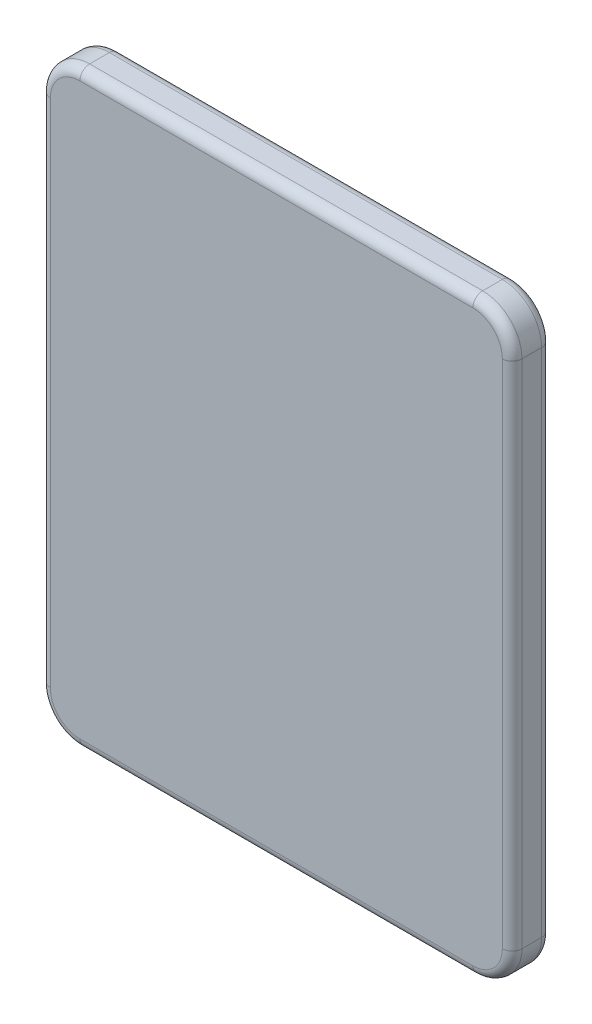
ISO-10303-21;
HEADER;
FILE_DESCRIPTION(('STEP AP214'),'2;1');
FILE_NAME('part.step','',(''),(''),'','','');
FILE_SCHEMA(('AUTOMOTIVE_DESIGN { 1 0 10303 214 1 1 1 1 }'));
ENDSEC;
DATA;
#1=APPLICATION_CONTEXT('core data for automotive mechanical design processes');
#2=APPLICATION_PROTOCOL_DEFINITION('international standard','automotive_design',2000,#1);
#3=PRODUCT_CONTEXT('',#1,'mechanical');
#4=PRODUCT('Part','Part','',(#3));
#5=PRODUCT_RELATED_PRODUCT_CATEGORY('part','',(#4));
#6=PRODUCT_DEFINITION_FORMATION('','',#4);
#7=PRODUCT_DEFINITION_CONTEXT('part definition',#1,'design');
#8=PRODUCT_DEFINITION('design','',#6,#7);
#9=PRODUCT_DEFINITION_SHAPE('','',#8);
#10=(LENGTH_UNIT() NAMED_UNIT(*) SI_UNIT(.MILLI.,.METRE.));
#11=(NAMED_UNIT(*) PLANE_ANGLE_UNIT() SI_UNIT($,.RADIAN.));
#12=(NAMED_UNIT(*) SI_UNIT($,.STERADIAN.) SOLID_ANGLE_UNIT());
#13=UNCERTAINTY_MEASURE_WITH_UNIT(LENGTH_MEASURE(1.E-05),#10,'distance_accuracy_value','');
#14=(GEOMETRIC_REPRESENTATION_CONTEXT(3) GLOBAL_UNCERTAINTY_ASSIGNED_CONTEXT((#13)) GLOBAL_UNIT_ASSIGNED_CONTEXT((#10,
#11,#12)) REPRESENTATION_CONTEXT('',''));
#15=CARTESIAN_POINT('',(0.,0.,0.));
#16=DIRECTION('',(0.,0.,1.));
#17=DIRECTION('',(1.,0.,0.));
#18=AXIS2_PLACEMENT_3D('',#15,#16,#17);
#19=CARTESIAN_POINT('',(-600.,-750.,100.));
#20=DIRECTION('',(1.,0.,0.));
#21=DIRECTION('',(0.,0.,-1.));
#22=AXIS2_PLACEMENT_3D('',#19,#20,#21);
#23=PLANE('',#22);
#24=DIRECTION('',(0.,0.,-1.));
#25=VECTOR('',#24,1.);
#26=CARTESIAN_POINT('',(-600.,650.,100.));
#27=LINE('',#26,#25);
#28=CARTESIAN_POINT('',(-600.,650.,75.));
#29=VERTEX_POINT('',#28);
#30=CARTESIAN_POINT('',(-600.,650.,25.));
#31=VERTEX_POINT('',#30);
#32=EDGE_CURVE('E334',#29,#31,#27,.T.);
#33=ORIENTED_EDGE('',*,*,#32,.T.);
#34=DIRECTION('',(0.,-1.,0.));
#35=VECTOR('',#34,1.);
#36=CARTESIAN_POINT('',(-600.,-750.,25.));
#37=LINE('',#36,#35);
#38=CARTESIAN_POINT('',(-600.,-650.,25.));
#39=VERTEX_POINT('',#38);
#40=EDGE_CURVE('E221',#31,#39,#37,.T.);
#41=ORIENTED_EDGE('',*,*,#40,.T.);
#42=DIRECTION('',(0.,0.,-1.));
#43=VECTOR('',#42,1.);
#44=CARTESIAN_POINT('',(-600.,-650.,100.));
#45=LINE('',#44,#43);
#46=CARTESIAN_POINT('',(-600.,-650.,75.));
#47=VERTEX_POINT('',#46);
#48=EDGE_CURVE('E340',#39,#47,#45,.F.);
#49=ORIENTED_EDGE('',*,*,#48,.T.);
#50=DIRECTION('',(0.,-1.,0.));
#51=VECTOR('',#50,1.);
#52=CARTESIAN_POINT('',(-600.,650.,75.));
#53=LINE('',#52,#51);
#54=EDGE_CURVE('E218',#47,#29,#53,.F.);
#55=ORIENTED_EDGE('',*,*,#54,.T.);
#56=EDGE_LOOP('',(#33,#41,#49,#55));
#57=FACE_BOUND('',#56,.T.);
#58=ADVANCED_FACE('F39',(#57),#23,.F.);
#59=CARTESIAN_POINT('',(600.,-750.,100.));
#60=DIRECTION('',(0.,1.,0.));
#61=DIRECTION('',(-1.,0.,0.));
#62=AXIS2_PLACEMENT_3D('',#59,#60,#61);
#63=PLANE('',#62);
#64=DIRECTION('',(0.,0.,-1.));
#65=VECTOR('',#64,1.);
#66=CARTESIAN_POINT('',(-500.,-750.,100.));
#67=LINE('',#66,#65);
#68=CARTESIAN_POINT('',(-500.,-750.,75.));
#69=VERTEX_POINT('',#68);
#70=CARTESIAN_POINT('',(-500.,-750.,25.));
#71=VERTEX_POINT('',#70);
#72=EDGE_CURVE('E331',#69,#71,#67,.T.);
#73=ORIENTED_EDGE('',*,*,#72,.T.);
#74=DIRECTION('',(1.,0.,0.));
#75=VECTOR('',#74,1.);
#76=CARTESIAN_POINT('',(600.,-750.,25.));
#77=LINE('',#76,#75);
#78=CARTESIAN_POINT('',(500.,-750.,25.));
#79=VERTEX_POINT('',#78);
#80=EDGE_CURVE('E233',#71,#79,#77,.T.);
#81=ORIENTED_EDGE('',*,*,#80,.T.);
#82=DIRECTION('',(0.,0.,-1.));
#83=VECTOR('',#82,1.);
#84=CARTESIAN_POINT('',(500.,-750.,100.));
#85=LINE('',#84,#83);
#86=CARTESIAN_POINT('',(500.,-750.,75.));
#87=VERTEX_POINT('',#86);
#88=EDGE_CURVE('E279',#79,#87,#85,.F.);
#89=ORIENTED_EDGE('',*,*,#88,.T.);
#90=DIRECTION('',(1.,0.,0.));
#91=VECTOR('',#90,1.);
#92=CARTESIAN_POINT('',(-500.,-750.,75.));
#93=LINE('',#92,#91);
#94=EDGE_CURVE('E230',#87,#69,#93,.F.);
#95=ORIENTED_EDGE('',*,*,#94,.T.);
#96=EDGE_LOOP('',(#73,#81,#89,#95));
#97=FACE_BOUND('',#96,.T.);
#98=ADVANCED_FACE('F328',(#97),#63,.F.);
#99=CARTESIAN_POINT('',(600.,-750.,100.));
#100=DIRECTION('',(-1.,0.,0.));
#101=DIRECTION('',(0.,0.,1.));
#102=AXIS2_PLACEMENT_3D('',#99,#100,#101);
#103=PLANE('',#102);
#104=DIRECTION('',(0.,0.,-1.));
#105=VECTOR('',#104,1.);
#106=CARTESIAN_POINT('',(600.,-650.,100.));
#107=LINE('',#106,#105);
#108=CARTESIAN_POINT('',(600.,-650.,75.));
#109=VERTEX_POINT('',#108);
#110=CARTESIAN_POINT('',(600.,-650.,25.));
#111=VERTEX_POINT('',#110);
#112=EDGE_CURVE('E325',#109,#111,#107,.T.);
#113=ORIENTED_EDGE('',*,*,#112,.T.);
#114=DIRECTION('',(0.,1.,0.));
#115=VECTOR('',#114,1.);
#116=CARTESIAN_POINT('',(600.,-750.,25.));
#117=LINE('',#116,#115);
#118=CARTESIAN_POINT('',(600.,650.,25.));
#119=VERTEX_POINT('',#118);
#120=EDGE_CURVE('E196',#111,#119,#117,.T.);
#121=ORIENTED_EDGE('',*,*,#120,.T.);
#122=DIRECTION('',(0.,0.,-1.));
#123=VECTOR('',#122,1.);
#124=CARTESIAN_POINT('',(600.,650.,100.));
#125=LINE('',#124,#123);
#126=CARTESIAN_POINT('',(600.,650.,75.));
#127=VERTEX_POINT('',#126);
#128=EDGE_CURVE('E344',#119,#127,#125,.F.);
#129=ORIENTED_EDGE('',*,*,#128,.T.);
#130=DIRECTION('',(0.,1.,0.));
#131=VECTOR('',#130,1.);
#132=CARTESIAN_POINT('',(600.,-650.,75.));
#133=LINE('',#132,#131);
#134=EDGE_CURVE('E193',#127,#109,#133,.F.);
#135=ORIENTED_EDGE('',*,*,#134,.T.);
#136=EDGE_LOOP('',(#113,#121,#129,#135));
#137=FACE_BOUND('',#136,.T.);
#138=ADVANCED_FACE('F380',(#137),#103,.F.);
#139=CARTESIAN_POINT('',(600.,750.,100.));
#140=DIRECTION('',(0.,-1.,0.));
#141=DIRECTION('',(1.,0.,0.));
#142=AXIS2_PLACEMENT_3D('',#139,#140,#141);
#143=PLANE('',#142);
#144=DIRECTION('',(0.,0.,-1.));
#145=VECTOR('',#144,1.);
#146=CARTESIAN_POINT('',(500.,750.,100.));
#147=LINE('',#146,#145);
#148=CARTESIAN_POINT('',(500.,750.,75.));
#149=VERTEX_POINT('',#148);
#150=CARTESIAN_POINT('',(500.,750.,25.));
#151=VERTEX_POINT('',#150);
#152=EDGE_CURVE('E175',#149,#151,#147,.T.);
#153=ORIENTED_EDGE('',*,*,#152,.T.);
#154=DIRECTION('',(-1.,0.,0.));
#155=VECTOR('',#154,1.);
#156=CARTESIAN_POINT('',(600.,750.,25.));
#157=LINE('',#156,#155);
#158=CARTESIAN_POINT('',(-500.,750.,25.));
#159=VERTEX_POINT('',#158);
#160=EDGE_CURVE('E208',#151,#159,#157,.T.);
#161=ORIENTED_EDGE('',*,*,#160,.T.);
#162=DIRECTION('',(0.,0.,-1.));
#163=VECTOR('',#162,1.);
#164=CARTESIAN_POINT('',(-500.,750.,100.));
#165=LINE('',#164,#163);
#166=CARTESIAN_POINT('',(-500.,750.,75.));
#167=VERTEX_POINT('',#166);
#168=EDGE_CURVE('E350',#159,#167,#165,.F.);
#169=ORIENTED_EDGE('',*,*,#168,.T.);
#170=DIRECTION('',(-1.,0.,0.));
#171=VECTOR('',#170,1.);
#172=CARTESIAN_POINT('',(500.,750.,75.));
#173=LINE('',#172,#171);
#174=EDGE_CURVE('E205',#167,#149,#173,.F.);
#175=ORIENTED_EDGE('',*,*,#174,.T.);
#176=EDGE_LOOP('',(#153,#161,#169,#175));
#177=FACE_BOUND('',#176,.T.);
#178=ADVANCED_FACE('F423',(#177),#143,.F.);
#179=CARTESIAN_POINT('',(0.,0.,100.));
#180=DIRECTION('',(0.,0.,1.));
#181=DIRECTION('',(1.,0.,0.));
#182=AXIS2_PLACEMENT_3D('',#179,#180,#181);
#183=PLANE('',#182);
#184=DIRECTION('',(-1.,0.,0.));
#185=VECTOR('',#184,1.);
#186=CARTESIAN_POINT('',(-500.,725.,100.));
#187=LINE('',#186,#185);
#188=CARTESIAN_POINT('',(500.,725.,100.));
#189=VERTEX_POINT('',#188);
#190=CARTESIAN_POINT('',(-500.,725.,100.));
#191=VERTEX_POINT('',#190);
#192=EDGE_CURVE('E49',#189,#191,#187,.T.);
#193=ORIENTED_EDGE('',*,*,#192,.T.);
#194=CARTESIAN_POINT('',(-500.,650.,100.));
#195=DIRECTION('',(0.,0.,1.));
#196=DIRECTION('',(1.,0.,0.));
#197=AXIS2_PLACEMENT_3D('',#194,#195,#196);
#198=CIRCLE('',#197,75.);
#199=CARTESIAN_POINT('',(-575.,650.,100.));
#200=VERTEX_POINT('',#199);
#201=EDGE_CURVE('E11',#191,#200,#198,.T.);
#202=ORIENTED_EDGE('',*,*,#201,.T.);
#203=DIRECTION('',(0.,-1.,0.));
#204=VECTOR('',#203,1.);
#205=CARTESIAN_POINT('',(-575.,-650.,100.));
#206=LINE('',#205,#204);
#207=CARTESIAN_POINT('',(-575.,-650.,100.));
#208=VERTEX_POINT('',#207);
#209=EDGE_CURVE('E236',#200,#208,#206,.T.);
#210=ORIENTED_EDGE('',*,*,#209,.T.);
#211=CARTESIAN_POINT('',(-500.,-650.,100.));
#212=DIRECTION('',(0.,0.,1.));
#213=DIRECTION('',(1.,0.,0.));
#214=AXIS2_PLACEMENT_3D('',#211,#212,#213);
#215=CIRCLE('',#214,75.);
#216=CARTESIAN_POINT('',(-500.,-725.,100.));
#217=VERTEX_POINT('',#216);
#218=EDGE_CURVE('E239',#208,#217,#215,.T.);
#219=ORIENTED_EDGE('',*,*,#218,.T.);
#220=DIRECTION('',(1.,0.,0.));
#221=VECTOR('',#220,1.);
#222=CARTESIAN_POINT('',(500.,-725.,100.));
#223=LINE('',#222,#221);
#224=CARTESIAN_POINT('',(500.,-725.,100.));
#225=VERTEX_POINT('',#224);
#226=EDGE_CURVE('E242',#217,#225,#223,.T.);
#227=ORIENTED_EDGE('',*,*,#226,.T.);
#228=CARTESIAN_POINT('',(500.,-650.,100.));
#229=DIRECTION('',(0.,0.,1.));
#230=DIRECTION('',(1.,0.,0.));
#231=AXIS2_PLACEMENT_3D('',#228,#229,#230);
#232=CIRCLE('',#231,75.);
#233=CARTESIAN_POINT('',(575.,-650.,100.));
#234=VERTEX_POINT('',#233);
#235=EDGE_CURVE('E245',#225,#234,#232,.T.);
#236=ORIENTED_EDGE('',*,*,#235,.T.);
#237=DIRECTION('',(0.,1.,0.));
#238=VECTOR('',#237,1.);
#239=CARTESIAN_POINT('',(575.,650.,100.));
#240=LINE('',#239,#238);
#241=CARTESIAN_POINT('',(575.,650.,100.));
#242=VERTEX_POINT('',#241);
#243=EDGE_CURVE('E248',#234,#242,#240,.T.);
#244=ORIENTED_EDGE('',*,*,#243,.T.);
#245=CARTESIAN_POINT('',(500.,650.,100.));
#246=DIRECTION('',(0.,0.,1.));
#247=DIRECTION('',(1.,0.,0.));
#248=AXIS2_PLACEMENT_3D('',#245,#246,#247);
#249=CIRCLE('',#248,75.);
#250=EDGE_CURVE('E60',#242,#189,#249,.T.);
#251=ORIENTED_EDGE('',*,*,#250,.T.);
#252=EDGE_LOOP('',(#193,#202,#210,#219,#227,#236,#244,#251));
#253=FACE_BOUND('',#252,.T.);
#254=ADVANCED_FACE('F396',(#253),#183,.T.);
#255=CARTESIAN_POINT('',(0.,0.,0.));
#256=DIRECTION('',(0.,0.,1.));
#257=DIRECTION('',(1.,0.,0.));
#258=AXIS2_PLACEMENT_3D('',#255,#256,#257);
#259=PLANE('',#258);
#260=DIRECTION('',(0.,1.,0.));
#261=VECTOR('',#260,1.);
#262=CARTESIAN_POINT('',(575.,0.,0.));
#263=LINE('',#262,#261);
#264=CARTESIAN_POINT('',(575.,650.,0.));
#265=VERTEX_POINT('',#264);
#266=CARTESIAN_POINT('',(575.,-650.,0.));
#267=VERTEX_POINT('',#266);
#268=EDGE_CURVE('E179',#265,#267,#263,.F.);
#269=ORIENTED_EDGE('',*,*,#268,.T.);
#270=CARTESIAN_POINT('',(500.,-650.,0.));
#271=DIRECTION('',(0.,0.,1.));
#272=DIRECTION('',(1.,0.,0.));
#273=AXIS2_PLACEMENT_3D('',#270,#271,#272);
#274=CIRCLE('',#273,75.);
#275=CARTESIAN_POINT('',(500.,-725.,0.));
#276=VERTEX_POINT('',#275);
#277=EDGE_CURVE('E158',#267,#276,#274,.F.);
#278=ORIENTED_EDGE('',*,*,#277,.T.);
#279=DIRECTION('',(1.,0.,0.));
#280=VECTOR('',#279,1.);
#281=CARTESIAN_POINT('',(0.,-725.,0.));
#282=LINE('',#281,#280);
#283=CARTESIAN_POINT('',(-500.,-725.,0.));
#284=VERTEX_POINT('',#283);
#285=EDGE_CURVE('E167',#276,#284,#282,.F.);
#286=ORIENTED_EDGE('',*,*,#285,.T.);
#287=CARTESIAN_POINT('',(-500.,-650.,0.));
#288=DIRECTION('',(0.,0.,1.));
#289=DIRECTION('',(1.,0.,0.));
#290=AXIS2_PLACEMENT_3D('',#287,#288,#289);
#291=CIRCLE('',#290,75.);
#292=CARTESIAN_POINT('',(-575.,-650.,0.));
#293=VERTEX_POINT('',#292);
#294=EDGE_CURVE('E174',#284,#293,#291,.F.);
#295=ORIENTED_EDGE('',*,*,#294,.T.);
#296=DIRECTION('',(0.,-1.,0.));
#297=VECTOR('',#296,1.);
#298=CARTESIAN_POINT('',(-575.,0.,0.));
#299=LINE('',#298,#297);
#300=CARTESIAN_POINT('',(-575.,650.,0.));
#301=VERTEX_POINT('',#300);
#302=EDGE_CURVE('E359',#293,#301,#299,.F.);
#303=ORIENTED_EDGE('',*,*,#302,.T.);
#304=CARTESIAN_POINT('',(-500.,650.,0.));
#305=DIRECTION('',(0.,0.,1.));
#306=DIRECTION('',(1.,0.,0.));
#307=AXIS2_PLACEMENT_3D('',#304,#305,#306);
#308=CIRCLE('',#307,75.);
#309=CARTESIAN_POINT('',(-500.,725.,0.));
#310=VERTEX_POINT('',#309);
#311=EDGE_CURVE('E362',#301,#310,#308,.F.);
#312=ORIENTED_EDGE('',*,*,#311,.T.);
#313=DIRECTION('',(-1.,0.,0.));
#314=VECTOR('',#313,1.);
#315=CARTESIAN_POINT('',(-1.34151948808873E-13,725.,0.));
#316=LINE('',#315,#314);
#317=CARTESIAN_POINT('',(500.,725.,0.));
#318=VERTEX_POINT('',#317);
#319=EDGE_CURVE('E365',#310,#318,#316,.F.);
#320=ORIENTED_EDGE('',*,*,#319,.T.);
#321=CARTESIAN_POINT('',(500.,650.,0.));
#322=DIRECTION('',(0.,0.,1.));
#323=DIRECTION('',(1.,0.,0.));
#324=AXIS2_PLACEMENT_3D('',#321,#322,#323);
#325=CIRCLE('',#324,75.);
#326=EDGE_CURVE('E187',#318,#265,#325,.F.);
#327=ORIENTED_EDGE('',*,*,#326,.T.);
#328=EDGE_LOOP('',(#269,#278,#286,#295,#303,#312,#320,#327));
#329=FACE_BOUND('',#328,.T.);
#330=ADVANCED_FACE('F177',(#329),#259,.F.);
#331=CARTESIAN_POINT('',(-500.,-650.,100.));
#332=DIRECTION('',(0.,0.,-1.));
#333=DIRECTION('',(-1.,0.,0.));
#334=AXIS2_PLACEMENT_3D('',#331,#332,#333);
#335=CYLINDRICAL_SURFACE('',#334,100.);
#336=ORIENTED_EDGE('',*,*,#48,.F.);
#337=CARTESIAN_POINT('',(-500.,-650.,25.));
#338=DIRECTION('',(0.,0.,1.));
#339=DIRECTION('',(1.,0.,0.));
#340=AXIS2_PLACEMENT_3D('',#337,#338,#339);
#341=CIRCLE('',#340,100.);
#342=EDGE_CURVE('E227',#39,#71,#341,.T.);
#343=ORIENTED_EDGE('',*,*,#342,.T.);
#344=ORIENTED_EDGE('',*,*,#72,.F.);
#345=CARTESIAN_POINT('',(-500.,-650.,75.));
#346=DIRECTION('',(0.,0.,1.));
#347=DIRECTION('',(1.,0.,0.));
#348=AXIS2_PLACEMENT_3D('',#345,#346,#347);
#349=CIRCLE('',#348,100.);
#350=EDGE_CURVE('E224',#69,#47,#349,.F.);
#351=ORIENTED_EDGE('',*,*,#350,.T.);
#352=EDGE_LOOP('',(#336,#343,#344,#351));
#353=FACE_BOUND('',#352,.T.);
#354=ADVANCED_FACE('F440',(#353),#335,.T.);
#355=CARTESIAN_POINT('',(500.,-650.,100.));
#356=DIRECTION('',(0.,0.,-1.));
#357=DIRECTION('',(-1.,0.,0.));
#358=AXIS2_PLACEMENT_3D('',#355,#356,#357);
#359=CYLINDRICAL_SURFACE('',#358,100.);
#360=ORIENTED_EDGE('',*,*,#88,.F.);
#361=CARTESIAN_POINT('',(500.,-650.,25.));
#362=DIRECTION('',(0.,0.,1.));
#363=DIRECTION('',(1.,0.,0.));
#364=AXIS2_PLACEMENT_3D('',#361,#362,#363);
#365=CIRCLE('',#364,100.);
#366=EDGE_CURVE('E160',#79,#111,#365,.T.);
#367=ORIENTED_EDGE('',*,*,#366,.T.);
#368=ORIENTED_EDGE('',*,*,#112,.F.);
#369=CARTESIAN_POINT('',(500.,-650.,75.));
#370=DIRECTION('',(0.,0.,1.));
#371=DIRECTION('',(1.,0.,0.));
#372=AXIS2_PLACEMENT_3D('',#369,#370,#371);
#373=CIRCLE('',#372,100.);
#374=EDGE_CURVE('E182',#109,#87,#373,.F.);
#375=ORIENTED_EDGE('',*,*,#374,.T.);
#376=EDGE_LOOP('',(#360,#367,#368,#375));
#377=FACE_BOUND('',#376,.T.);
#378=ADVANCED_FACE('F323',(#377),#359,.T.);
#379=CARTESIAN_POINT('',(500.,650.,100.));
#380=DIRECTION('',(0.,0.,-1.));
#381=DIRECTION('',(-1.,0.,0.));
#382=AXIS2_PLACEMENT_3D('',#379,#380,#381);
#383=CYLINDRICAL_SURFACE('',#382,100.);
#384=ORIENTED_EDGE('',*,*,#128,.F.);
#385=CARTESIAN_POINT('',(500.,650.,25.));
#386=DIRECTION('',(0.,0.,1.));
#387=DIRECTION('',(1.,0.,0.));
#388=AXIS2_PLACEMENT_3D('',#385,#386,#387);
#389=CIRCLE('',#388,100.);
#390=EDGE_CURVE('E202',#119,#151,#389,.T.);
#391=ORIENTED_EDGE('',*,*,#390,.T.);
#392=ORIENTED_EDGE('',*,*,#152,.F.);
#393=CARTESIAN_POINT('',(500.,650.,75.));
#394=DIRECTION('',(0.,0.,1.));
#395=DIRECTION('',(1.,0.,0.));
#396=AXIS2_PLACEMENT_3D('',#393,#394,#395);
#397=CIRCLE('',#396,100.);
#398=EDGE_CURVE('E199',#149,#127,#397,.F.);
#399=ORIENTED_EDGE('',*,*,#398,.T.);
#400=EDGE_LOOP('',(#384,#391,#392,#399));
#401=FACE_BOUND('',#400,.T.);
#402=ADVANCED_FACE('F382',(#401),#383,.T.);
#403=CARTESIAN_POINT('',(-500.,650.,100.));
#404=DIRECTION('',(0.,0.,-1.));
#405=DIRECTION('',(-1.,0.,0.));
#406=AXIS2_PLACEMENT_3D('',#403,#404,#405);
#407=CYLINDRICAL_SURFACE('',#406,100.);
#408=ORIENTED_EDGE('',*,*,#168,.F.);
#409=CARTESIAN_POINT('',(-500.,650.,25.));
#410=DIRECTION('',(0.,0.,1.));
#411=DIRECTION('',(1.,0.,0.));
#412=AXIS2_PLACEMENT_3D('',#409,#410,#411);
#413=CIRCLE('',#412,100.);
#414=EDGE_CURVE('E215',#159,#31,#413,.T.);
#415=ORIENTED_EDGE('',*,*,#414,.T.);
#416=ORIENTED_EDGE('',*,*,#32,.F.);
#417=CARTESIAN_POINT('',(-500.,650.,75.));
#418=DIRECTION('',(0.,0.,1.));
#419=DIRECTION('',(1.,0.,0.));
#420=AXIS2_PLACEMENT_3D('',#417,#418,#419);
#421=CIRCLE('',#420,100.);
#422=EDGE_CURVE('E211',#29,#167,#421,.F.);
#423=ORIENTED_EDGE('',*,*,#422,.T.);
#424=EDGE_LOOP('',(#408,#415,#416,#423));
#425=FACE_BOUND('',#424,.T.);
#426=ADVANCED_FACE('F412',(#425),#407,.T.);
#427=CARTESIAN_POINT('',(-500.,650.,25.));
#428=DIRECTION('',(0.,0.,1.));
#429=DIRECTION('',(1.,0.,0.));
#430=AXIS2_PLACEMENT_3D('',#427,#428,#429);
#431=TOROIDAL_SURFACE('',#430,75.,25.);
#432=CARTESIAN_POINT('',(-575.,650.,25.));
#433=DIRECTION('',(0.,-1.,0.));
#434=DIRECTION('',(0.,0.,-1.));
#435=AXIS2_PLACEMENT_3D('',#432,#433,#434);
#436=CIRCLE('',#435,25.);
#437=EDGE_CURVE('E271',#31,#301,#436,.T.);
#438=ORIENTED_EDGE('',*,*,#437,.F.);
#439=ORIENTED_EDGE('',*,*,#414,.F.);
#440=CARTESIAN_POINT('',(-500.,725.,25.));
#441=DIRECTION('',(1.,0.,0.));
#442=DIRECTION('',(0.,0.,-1.));
#443=AXIS2_PLACEMENT_3D('',#440,#441,#442);
#444=CIRCLE('',#443,25.);
#445=EDGE_CURVE('E275',#310,#159,#444,.T.);
#446=ORIENTED_EDGE('',*,*,#445,.F.);
#447=ORIENTED_EDGE('',*,*,#311,.F.);
#448=EDGE_LOOP('',(#438,#439,#446,#447));
#449=FACE_BOUND('',#448,.T.);
#450=ADVANCED_FACE('F416',(#449),#431,.T.);
#451=CARTESIAN_POINT('',(600.,725.,25.));
#452=DIRECTION('',(-1.,0.,0.));
#453=DIRECTION('',(0.,-1.,0.));
#454=AXIS2_PLACEMENT_3D('',#451,#452,#453);
#455=CYLINDRICAL_SURFACE('',#454,25.);
#456=ORIENTED_EDGE('',*,*,#445,.T.);
#457=ORIENTED_EDGE('',*,*,#160,.F.);
#458=CARTESIAN_POINT('',(500.,725.,25.));
#459=DIRECTION('',(1.,0.,0.));
#460=DIRECTION('',(0.,0.,-1.));
#461=AXIS2_PLACEMENT_3D('',#458,#459,#460);
#462=CIRCLE('',#461,25.);
#463=EDGE_CURVE('E267',#318,#151,#462,.T.);
#464=ORIENTED_EDGE('',*,*,#463,.F.);
#465=ORIENTED_EDGE('',*,*,#319,.F.);
#466=EDGE_LOOP('',(#456,#457,#464,#465));
#467=FACE_BOUND('',#466,.T.);
#468=ADVANCED_FACE('F421',(#467),#455,.T.);
#469=CARTESIAN_POINT('',(-575.,-750.,25.));
#470=DIRECTION('',(0.,-1.,0.));
#471=DIRECTION('',(0.,0.,-1.));
#472=AXIS2_PLACEMENT_3D('',#469,#470,#471);
#473=CYLINDRICAL_SURFACE('',#472,25.);
#474=ORIENTED_EDGE('',*,*,#437,.T.);
#475=ORIENTED_EDGE('',*,*,#302,.F.);
#476=CARTESIAN_POINT('',(-575.,-650.,25.));
#477=DIRECTION('',(0.,-1.,0.));
#478=DIRECTION('',(0.,0.,-1.));
#479=AXIS2_PLACEMENT_3D('',#476,#477,#478);
#480=CIRCLE('',#479,25.);
#481=EDGE_CURVE('E263',#39,#293,#480,.T.);
#482=ORIENTED_EDGE('',*,*,#481,.F.);
#483=ORIENTED_EDGE('',*,*,#40,.F.);
#484=EDGE_LOOP('',(#474,#475,#482,#483));
#485=FACE_BOUND('',#484,.T.);
#486=ADVANCED_FACE('F462',(#485),#473,.T.);
#487=CARTESIAN_POINT('',(500.,650.,25.));
#488=DIRECTION('',(0.,0.,1.));
#489=DIRECTION('',(1.,0.,0.));
#490=AXIS2_PLACEMENT_3D('',#487,#488,#489);
#491=TOROIDAL_SURFACE('',#490,75.,25.);
#492=ORIENTED_EDGE('',*,*,#463,.T.);
#493=ORIENTED_EDGE('',*,*,#390,.F.);
#494=CARTESIAN_POINT('',(575.,650.,25.));
#495=DIRECTION('',(0.,-1.,0.));
#496=DIRECTION('',(0.,0.,-1.));
#497=AXIS2_PLACEMENT_3D('',#494,#495,#496);
#498=CIRCLE('',#497,25.);
#499=EDGE_CURVE('E259',#265,#119,#498,.T.);
#500=ORIENTED_EDGE('',*,*,#499,.F.);
#501=ORIENTED_EDGE('',*,*,#326,.F.);
#502=EDGE_LOOP('',(#492,#493,#500,#501));
#503=FACE_BOUND('',#502,.T.);
#504=ADVANCED_FACE('F374',(#503),#491,.T.);
#505=CARTESIAN_POINT('',(-500.,-650.,25.));
#506=DIRECTION('',(0.,0.,1.));
#507=DIRECTION('',(1.,0.,0.));
#508=AXIS2_PLACEMENT_3D('',#505,#506,#507);
#509=TOROIDAL_SURFACE('',#508,75.,25.);
#510=ORIENTED_EDGE('',*,*,#481,.T.);
#511=ORIENTED_EDGE('',*,*,#294,.F.);
#512=CARTESIAN_POINT('',(-500.,-725.,25.));
#513=DIRECTION('',(1.,0.,0.));
#514=DIRECTION('',(0.,0.,-1.));
#515=AXIS2_PLACEMENT_3D('',#512,#513,#514);
#516=CIRCLE('',#515,25.);
#517=EDGE_CURVE('E170',#71,#284,#516,.T.);
#518=ORIENTED_EDGE('',*,*,#517,.F.);
#519=ORIENTED_EDGE('',*,*,#342,.F.);
#520=EDGE_LOOP('',(#510,#511,#518,#519));
#521=FACE_BOUND('',#520,.T.);
#522=ADVANCED_FACE('F456',(#521),#509,.T.);
#523=CARTESIAN_POINT('',(575.,-750.,25.));
#524=DIRECTION('',(0.,1.,0.));
#525=DIRECTION('',(0.,0.,1.));
#526=AXIS2_PLACEMENT_3D('',#523,#524,#525);
#527=CYLINDRICAL_SURFACE('',#526,25.);
#528=ORIENTED_EDGE('',*,*,#499,.T.);
#529=ORIENTED_EDGE('',*,*,#120,.F.);
#530=CARTESIAN_POINT('',(575.,-650.,25.));
#531=DIRECTION('',(0.,-1.,0.));
#532=DIRECTION('',(0.,0.,-1.));
#533=AXIS2_PLACEMENT_3D('',#530,#531,#532);
#534=CIRCLE('',#533,25.);
#535=EDGE_CURVE('E164',#267,#111,#534,.T.);
#536=ORIENTED_EDGE('',*,*,#535,.F.);
#537=ORIENTED_EDGE('',*,*,#268,.F.);
#538=EDGE_LOOP('',(#528,#529,#536,#537));
#539=FACE_BOUND('',#538,.T.);
#540=ADVANCED_FACE('F377',(#539),#527,.T.);
#541=CARTESIAN_POINT('',(600.,-725.,25.));
#542=DIRECTION('',(1.,0.,0.));
#543=DIRECTION('',(0.,1.,0.));
#544=AXIS2_PLACEMENT_3D('',#541,#542,#543);
#545=CYLINDRICAL_SURFACE('',#544,25.);
#546=ORIENTED_EDGE('',*,*,#517,.T.);
#547=ORIENTED_EDGE('',*,*,#285,.F.);
#548=CARTESIAN_POINT('',(500.,-725.,25.));
#549=DIRECTION('',(1.,0.,0.));
#550=DIRECTION('',(0.,0.,-1.));
#551=AXIS2_PLACEMENT_3D('',#548,#549,#550);
#552=CIRCLE('',#551,25.);
#553=EDGE_CURVE('E154',#79,#276,#552,.T.);
#554=ORIENTED_EDGE('',*,*,#553,.F.);
#555=ORIENTED_EDGE('',*,*,#80,.F.);
#556=EDGE_LOOP('',(#546,#547,#554,#555));
#557=FACE_BOUND('',#556,.T.);
#558=ADVANCED_FACE('F168',(#557),#545,.T.);
#559=CARTESIAN_POINT('',(500.,-650.,25.));
#560=DIRECTION('',(0.,0.,1.));
#561=DIRECTION('',(1.,0.,0.));
#562=AXIS2_PLACEMENT_3D('',#559,#560,#561);
#563=TOROIDAL_SURFACE('',#562,75.,25.);
#564=ORIENTED_EDGE('',*,*,#535,.T.);
#565=ORIENTED_EDGE('',*,*,#366,.F.);
#566=ORIENTED_EDGE('',*,*,#553,.T.);
#567=ORIENTED_EDGE('',*,*,#277,.F.);
#568=EDGE_LOOP('',(#564,#565,#566,#567));
#569=FACE_BOUND('',#568,.T.);
#570=ADVANCED_FACE('F156',(#569),#563,.T.);
#571=CARTESIAN_POINT('',(500.,-650.,75.));
#572=DIRECTION('',(0.,0.,1.));
#573=DIRECTION('',(1.,0.,0.));
#574=AXIS2_PLACEMENT_3D('',#571,#572,#573);
#575=TOROIDAL_SURFACE('',#574,75.,25.);
#576=CARTESIAN_POINT('',(500.,-725.,75.));
#577=DIRECTION('',(-1.,0.,0.));
#578=DIRECTION('',(0.,0.,1.));
#579=AXIS2_PLACEMENT_3D('',#576,#577,#578);
#580=CIRCLE('',#579,25.);
#581=EDGE_CURVE('E301',#87,#225,#580,.T.);
#582=ORIENTED_EDGE('',*,*,#581,.F.);
#583=ORIENTED_EDGE('',*,*,#374,.F.);
#584=CARTESIAN_POINT('',(575.,-650.,75.));
#585=DIRECTION('',(0.,1.,0.));
#586=DIRECTION('',(0.,0.,1.));
#587=AXIS2_PLACEMENT_3D('',#584,#585,#586);
#588=CIRCLE('',#587,25.);
#589=EDGE_CURVE('E43',#234,#109,#588,.T.);
#590=ORIENTED_EDGE('',*,*,#589,.F.);
#591=ORIENTED_EDGE('',*,*,#235,.F.);
#592=EDGE_LOOP('',(#582,#583,#590,#591));
#593=FACE_BOUND('',#592,.T.);
#594=ADVANCED_FACE('F41',(#593),#575,.T.);
#595=CARTESIAN_POINT('',(575.,0.,75.));
#596=DIRECTION('',(0.,-1.,0.));
#597=DIRECTION('',(0.,0.,-1.));
#598=AXIS2_PLACEMENT_3D('',#595,#596,#597);
#599=CYLINDRICAL_SURFACE('',#598,25.);
#600=ORIENTED_EDGE('',*,*,#589,.T.);
#601=ORIENTED_EDGE('',*,*,#134,.F.);
#602=CARTESIAN_POINT('',(575.,650.,75.));
#603=DIRECTION('',(0.,1.,0.));
#604=DIRECTION('',(0.,0.,1.));
#605=AXIS2_PLACEMENT_3D('',#602,#603,#604);
#606=CIRCLE('',#605,25.);
#607=EDGE_CURVE('E298',#242,#127,#606,.T.);
#608=ORIENTED_EDGE('',*,*,#607,.F.);
#609=ORIENTED_EDGE('',*,*,#243,.F.);
#610=EDGE_LOOP('',(#600,#601,#608,#609));
#611=FACE_BOUND('',#610,.T.);
#612=ADVANCED_FACE('F314',(#611),#599,.T.);
#613=CARTESIAN_POINT('',(0.,-725.,75.));
#614=DIRECTION('',(-1.,0.,0.));
#615=DIRECTION('',(0.,-1.,0.));
#616=AXIS2_PLACEMENT_3D('',#613,#614,#615);
#617=CYLINDRICAL_SURFACE('',#616,25.);
#618=ORIENTED_EDGE('',*,*,#581,.T.);
#619=ORIENTED_EDGE('',*,*,#226,.F.);
#620=CARTESIAN_POINT('',(-500.,-725.,75.));
#621=DIRECTION('',(-1.,0.,0.));
#622=DIRECTION('',(0.,0.,1.));
#623=AXIS2_PLACEMENT_3D('',#620,#621,#622);
#624=CIRCLE('',#623,25.);
#625=EDGE_CURVE('E294',#69,#217,#624,.T.);
#626=ORIENTED_EDGE('',*,*,#625,.F.);
#627=ORIENTED_EDGE('',*,*,#94,.F.);
#628=EDGE_LOOP('',(#618,#619,#626,#627));
#629=FACE_BOUND('',#628,.T.);
#630=ADVANCED_FACE('F480',(#629),#617,.T.);
#631=CARTESIAN_POINT('',(500.,650.,75.));
#632=DIRECTION('',(0.,0.,1.));
#633=DIRECTION('',(1.,0.,0.));
#634=AXIS2_PLACEMENT_3D('',#631,#632,#633);
#635=TOROIDAL_SURFACE('',#634,75.,25.);
#636=ORIENTED_EDGE('',*,*,#607,.T.);
#637=ORIENTED_EDGE('',*,*,#398,.F.);
#638=CARTESIAN_POINT('',(500.,725.,75.));
#639=DIRECTION('',(-1.,0.,0.));
#640=DIRECTION('',(0.,0.,1.));
#641=AXIS2_PLACEMENT_3D('',#638,#639,#640);
#642=CIRCLE('',#641,25.);
#643=EDGE_CURVE('E290',#189,#149,#642,.T.);
#644=ORIENTED_EDGE('',*,*,#643,.F.);
#645=ORIENTED_EDGE('',*,*,#250,.F.);
#646=EDGE_LOOP('',(#636,#637,#644,#645));
#647=FACE_BOUND('',#646,.T.);
#648=ADVANCED_FACE('F386',(#647),#635,.T.);
#649=CARTESIAN_POINT('',(-500.,-650.,75.));
#650=DIRECTION('',(0.,0.,1.));
#651=DIRECTION('',(1.,0.,0.));
#652=AXIS2_PLACEMENT_3D('',#649,#650,#651);
#653=TOROIDAL_SURFACE('',#652,75.,25.);
#654=ORIENTED_EDGE('',*,*,#625,.T.);
#655=ORIENTED_EDGE('',*,*,#218,.F.);
#656=CARTESIAN_POINT('',(-575.,-650.,75.));
#657=DIRECTION('',(0.,1.,0.));
#658=DIRECTION('',(0.,0.,1.));
#659=AXIS2_PLACEMENT_3D('',#656,#657,#658);
#660=CIRCLE('',#659,25.);
#661=EDGE_CURVE('E286',#47,#208,#660,.T.);
#662=ORIENTED_EDGE('',*,*,#661,.F.);
#663=ORIENTED_EDGE('',*,*,#350,.F.);
#664=EDGE_LOOP('',(#654,#655,#662,#663));
#665=FACE_BOUND('',#664,.T.);
#666=ADVANCED_FACE('F401',(#665),#653,.T.);
#667=CARTESIAN_POINT('',(-1.34151948808873E-13,725.,75.));
#668=DIRECTION('',(1.,0.,0.));
#669=DIRECTION('',(0.,1.,0.));
#670=AXIS2_PLACEMENT_3D('',#667,#668,#669);
#671=CYLINDRICAL_SURFACE('',#670,25.);
#672=ORIENTED_EDGE('',*,*,#643,.T.);
#673=ORIENTED_EDGE('',*,*,#174,.F.);
#674=CARTESIAN_POINT('',(-500.,725.,75.));
#675=DIRECTION('',(-1.,0.,0.));
#676=DIRECTION('',(0.,-1.,0.));
#677=AXIS2_PLACEMENT_3D('',#674,#675,#676);
#678=CIRCLE('',#677,25.);
#679=EDGE_CURVE('E283',#191,#167,#678,.T.);
#680=ORIENTED_EDGE('',*,*,#679,.F.);
#681=ORIENTED_EDGE('',*,*,#192,.F.);
#682=EDGE_LOOP('',(#672,#673,#680,#681));
#683=FACE_BOUND('',#682,.T.);
#684=ADVANCED_FACE('F389',(#683),#671,.T.);
#685=CARTESIAN_POINT('',(-575.,0.,75.));
#686=DIRECTION('',(0.,1.,0.));
#687=DIRECTION('',(0.,0.,1.));
#688=AXIS2_PLACEMENT_3D('',#685,#686,#687);
#689=CYLINDRICAL_SURFACE('',#688,25.);
#690=ORIENTED_EDGE('',*,*,#661,.T.);
#691=ORIENTED_EDGE('',*,*,#209,.F.);
#692=CARTESIAN_POINT('',(-575.,650.,75.));
#693=DIRECTION('',(0.,1.,0.));
#694=DIRECTION('',(0.,0.,1.));
#695=AXIS2_PLACEMENT_3D('',#692,#693,#694);
#696=CIRCLE('',#695,25.);
#697=EDGE_CURVE('E280',#29,#200,#696,.T.);
#698=ORIENTED_EDGE('',*,*,#697,.F.);
#699=ORIENTED_EDGE('',*,*,#54,.F.);
#700=EDGE_LOOP('',(#690,#691,#698,#699));
#701=FACE_BOUND('',#700,.T.);
#702=ADVANCED_FACE('F405',(#701),#689,.T.);
#703=CARTESIAN_POINT('',(-500.,650.,75.));
#704=DIRECTION('',(0.,0.,1.));
#705=DIRECTION('',(1.,0.,0.));
#706=AXIS2_PLACEMENT_3D('',#703,#704,#705);
#707=TOROIDAL_SURFACE('',#706,75.,25.);
#708=ORIENTED_EDGE('',*,*,#679,.T.);
#709=ORIENTED_EDGE('',*,*,#422,.F.);
#710=ORIENTED_EDGE('',*,*,#697,.T.);
#711=ORIENTED_EDGE('',*,*,#201,.F.);
#712=EDGE_LOOP('',(#708,#709,#710,#711));
#713=FACE_BOUND('',#712,.T.);
#714=ADVANCED_FACE('F393',(#713),#707,.T.);
#715=CLOSED_SHELL('',(#58,#98,#138,#178,#254,#330,#354,#378,#402,#426,#450,#468,#486,#504,#522,
#540,#558,#570,#594,#612,#630,#648,#666,#684,#702,#714));
#716=MANIFOLD_SOLID_BREP('B2',#715);
#717=ADVANCED_BREP_SHAPE_REPRESENTATION('',(#18,#716),#14);
#718=SHAPE_DEFINITION_REPRESENTATION(#9,#717);
ENDSEC;
END-ISO-10303-21;
